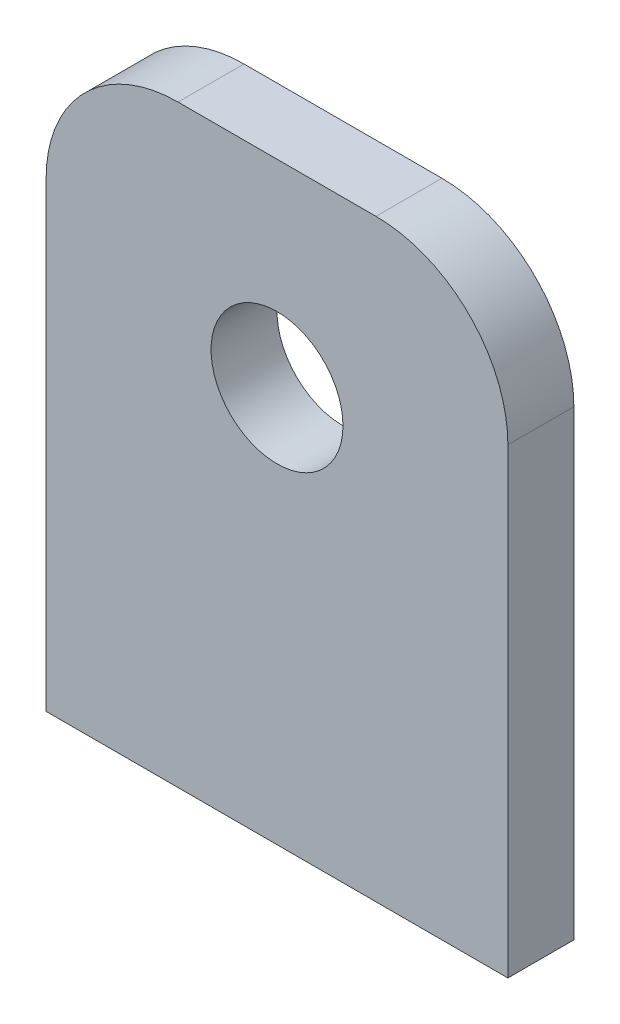
ISO-10303-21;
HEADER;
FILE_DESCRIPTION(('STEP AP214'),'2;1');
FILE_NAME('part.step','',(''),(''),'','','');
FILE_SCHEMA(('AUTOMOTIVE_DESIGN { 1 0 10303 214 1 1 1 1 }'));
ENDSEC;
DATA;
#1=APPLICATION_CONTEXT('core data for automotive mechanical design processes');
#2=APPLICATION_PROTOCOL_DEFINITION('international standard','automotive_design',2000,#1);
#3=PRODUCT_CONTEXT('',#1,'mechanical');
#4=PRODUCT('Part','Part','',(#3));
#5=PRODUCT_RELATED_PRODUCT_CATEGORY('part','',(#4));
#6=PRODUCT_DEFINITION_FORMATION('','',#4);
#7=PRODUCT_DEFINITION_CONTEXT('part definition',#1,'design');
#8=PRODUCT_DEFINITION('design','',#6,#7);
#9=PRODUCT_DEFINITION_SHAPE('','',#8);
#10=(LENGTH_UNIT() NAMED_UNIT(*) SI_UNIT(.MILLI.,.METRE.));
#11=(NAMED_UNIT(*) PLANE_ANGLE_UNIT() SI_UNIT($,.RADIAN.));
#12=(NAMED_UNIT(*) SI_UNIT($,.STERADIAN.) SOLID_ANGLE_UNIT());
#13=UNCERTAINTY_MEASURE_WITH_UNIT(LENGTH_MEASURE(1.E-05),#10,'distance_accuracy_value','');
#14=(GEOMETRIC_REPRESENTATION_CONTEXT(3) GLOBAL_UNCERTAINTY_ASSIGNED_CONTEXT((#13)) GLOBAL_UNIT_ASSIGNED_CONTEXT((#10,
#11,#12)) REPRESENTATION_CONTEXT('',''));
#15=CARTESIAN_POINT('',(0.,0.,0.));
#16=DIRECTION('',(0.,0.,1.));
#17=DIRECTION('',(1.,0.,0.));
#18=AXIS2_PLACEMENT_3D('',#15,#16,#17);
#19=CARTESIAN_POINT('',(11.1125,-14.2875,3.175));
#20=DIRECTION('',(-1.,0.,0.));
#21=DIRECTION('',(0.,0.,1.));
#22=AXIS2_PLACEMENT_3D('',#19,#20,#21);
#23=PLANE('',#22);
#24=DIRECTION('',(0.,1.,0.));
#25=VECTOR('',#24,1.);
#26=CARTESIAN_POINT('',(11.1125,-14.2875,0.));
#27=LINE('',#26,#25);
#28=CARTESIAN_POINT('',(11.1125,-14.2875,0.));
#29=VERTEX_POINT('',#28);
#30=CARTESIAN_POINT('',(11.1125,7.93750000000001,0.));
#31=VERTEX_POINT('',#30);
#32=EDGE_CURVE('E117',#29,#31,#27,.T.);
#33=ORIENTED_EDGE('',*,*,#32,.T.);
#34=DIRECTION('',(0.,0.,-1.));
#35=VECTOR('',#34,1.);
#36=CARTESIAN_POINT('',(11.1125,7.93750000000001,3.175));
#37=LINE('',#36,#35);
#38=CARTESIAN_POINT('',(11.1125,7.93750000000001,3.175));
#39=VERTEX_POINT('',#38);
#40=EDGE_CURVE('E11',#31,#39,#37,.F.);
#41=ORIENTED_EDGE('',*,*,#40,.T.);
#42=DIRECTION('',(0.,1.,0.));
#43=VECTOR('',#42,1.);
#44=CARTESIAN_POINT('',(11.1125,-14.2875,3.175));
#45=LINE('',#44,#43);
#46=CARTESIAN_POINT('',(11.1125,-14.2875,3.175));
#47=VERTEX_POINT('',#46);
#48=EDGE_CURVE('E124',#47,#39,#45,.T.);
#49=ORIENTED_EDGE('',*,*,#48,.F.);
#50=DIRECTION('',(0.,0.,-1.));
#51=VECTOR('',#50,1.);
#52=CARTESIAN_POINT('',(11.1125,-14.2875,3.175));
#53=LINE('',#52,#51);
#54=EDGE_CURVE('E109',#47,#29,#53,.T.);
#55=ORIENTED_EDGE('',*,*,#54,.T.);
#56=EDGE_LOOP('',(#33,#41,#49,#55));
#57=FACE_BOUND('',#56,.T.);
#58=ADVANCED_FACE('F35',(#57),#23,.F.);
#59=CARTESIAN_POINT('',(-11.1125,14.2875,3.175));
#60=DIRECTION('',(0.,-1.,0.));
#61=DIRECTION('',(0.,0.,-1.));
#62=AXIS2_PLACEMENT_3D('',#59,#60,#61);
#63=PLANE('',#62);
#64=DIRECTION('',(-1.,0.,0.));
#65=VECTOR('',#64,1.);
#66=CARTESIAN_POINT('',(-11.1125,14.2875,0.));
#67=LINE('',#66,#65);
#68=CARTESIAN_POINT('',(4.7625,14.2875,0.));
#69=VERTEX_POINT('',#68);
#70=CARTESIAN_POINT('',(-4.7625,14.2875,0.));
#71=VERTEX_POINT('',#70);
#72=EDGE_CURVE('E119',#69,#71,#67,.T.);
#73=ORIENTED_EDGE('',*,*,#72,.T.);
#74=DIRECTION('',(0.,0.,-1.));
#75=VECTOR('',#74,1.);
#76=CARTESIAN_POINT('',(-4.7625,14.2875,3.175));
#77=LINE('',#76,#75);
#78=CARTESIAN_POINT('',(-4.7625,14.2875,3.175));
#79=VERTEX_POINT('',#78);
#80=EDGE_CURVE('E56',#71,#79,#77,.F.);
#81=ORIENTED_EDGE('',*,*,#80,.T.);
#82=DIRECTION('',(-1.,0.,0.));
#83=VECTOR('',#82,1.);
#84=CARTESIAN_POINT('',(-11.1125,14.2875,3.175));
#85=LINE('',#84,#83);
#86=CARTESIAN_POINT('',(4.7625,14.2875,3.175));
#87=VERTEX_POINT('',#86);
#88=EDGE_CURVE('E99',#87,#79,#85,.T.);
#89=ORIENTED_EDGE('',*,*,#88,.F.);
#90=DIRECTION('',(0.,0.,-1.));
#91=VECTOR('',#90,1.);
#92=CARTESIAN_POINT('',(4.7625,14.2875,3.175));
#93=LINE('',#92,#91);
#94=EDGE_CURVE('E131',#87,#69,#93,.T.);
#95=ORIENTED_EDGE('',*,*,#94,.T.);
#96=EDGE_LOOP('',(#73,#81,#89,#95));
#97=FACE_BOUND('',#96,.T.);
#98=ADVANCED_FACE('F139',(#97),#63,.F.);
#99=CARTESIAN_POINT('',(-11.1125,-14.2875,3.175));
#100=DIRECTION('',(1.,0.,0.));
#101=DIRECTION('',(0.,0.,-1.));
#102=AXIS2_PLACEMENT_3D('',#99,#100,#101);
#103=PLANE('',#102);
#104=DIRECTION('',(0.,-1.,0.));
#105=VECTOR('',#104,1.);
#106=CARTESIAN_POINT('',(-11.1125,-14.2875,3.175));
#107=LINE('',#106,#105);
#108=CARTESIAN_POINT('',(-11.1125,7.93750000000001,3.175));
#109=VERTEX_POINT('',#108);
#110=CARTESIAN_POINT('',(-11.1125,-14.2875,3.175));
#111=VERTEX_POINT('',#110);
#112=EDGE_CURVE('E89',#109,#111,#107,.T.);
#113=ORIENTED_EDGE('',*,*,#112,.F.);
#114=DIRECTION('',(0.,0.,-1.));
#115=VECTOR('',#114,1.);
#116=CARTESIAN_POINT('',(-11.1125,7.93750000000001,3.175));
#117=LINE('',#116,#115);
#118=CARTESIAN_POINT('',(-11.1125,7.93750000000001,0.));
#119=VERTEX_POINT('',#118);
#120=EDGE_CURVE('E108',#109,#119,#117,.T.);
#121=ORIENTED_EDGE('',*,*,#120,.T.);
#122=DIRECTION('',(0.,-1.,0.));
#123=VECTOR('',#122,1.);
#124=CARTESIAN_POINT('',(-11.1125,-14.2875,0.));
#125=LINE('',#124,#123);
#126=CARTESIAN_POINT('',(-11.1125,-14.2875,0.));
#127=VERTEX_POINT('',#126);
#128=EDGE_CURVE('E105',#119,#127,#125,.T.);
#129=ORIENTED_EDGE('',*,*,#128,.T.);
#130=DIRECTION('',(0.,0.,-1.));
#131=VECTOR('',#130,1.);
#132=CARTESIAN_POINT('',(-11.1125,-14.2875,3.175));
#133=LINE('',#132,#131);
#134=EDGE_CURVE('E102',#111,#127,#133,.T.);
#135=ORIENTED_EDGE('',*,*,#134,.F.);
#136=EDGE_LOOP('',(#113,#121,#129,#135));
#137=FACE_BOUND('',#136,.T.);
#138=ADVANCED_FACE('F103',(#137),#103,.F.);
#139=CARTESIAN_POINT('',(-11.1125,-14.2875,3.175));
#140=DIRECTION('',(0.,1.,0.));
#141=DIRECTION('',(0.,0.,1.));
#142=AXIS2_PLACEMENT_3D('',#139,#140,#141);
#143=PLANE('',#142);
#144=DIRECTION('',(1.,0.,0.));
#145=VECTOR('',#144,1.);
#146=CARTESIAN_POINT('',(-11.1125,-14.2875,0.));
#147=LINE('',#146,#145);
#148=EDGE_CURVE('E123',#127,#29,#147,.T.);
#149=ORIENTED_EDGE('',*,*,#148,.T.);
#150=ORIENTED_EDGE('',*,*,#54,.F.);
#151=DIRECTION('',(1.,0.,0.));
#152=VECTOR('',#151,1.);
#153=CARTESIAN_POINT('',(-11.1125,-14.2875,3.175));
#154=LINE('',#153,#152);
#155=EDGE_CURVE('E93',#111,#47,#154,.T.);
#156=ORIENTED_EDGE('',*,*,#155,.F.);
#157=ORIENTED_EDGE('',*,*,#134,.T.);
#158=EDGE_LOOP('',(#149,#150,#156,#157));
#159=FACE_BOUND('',#158,.T.);
#160=ADVANCED_FACE('F111',(#159),#143,.F.);
#161=CARTESIAN_POINT('',(11.1125,14.2875,3.175));
#162=DIRECTION('',(0.,0.,-1.));
#163=DIRECTION('',(-1.,0.,0.));
#164=AXIS2_PLACEMENT_3D('',#161,#162,#163);
#165=PLANE('',#164);
#166=CARTESIAN_POINT('',(0.,4.76250000000001,3.175));
#167=DIRECTION('',(0.,0.,1.));
#168=DIRECTION('',(1.,0.,0.));
#169=AXIS2_PLACEMENT_3D('',#166,#167,#168);
#170=CIRCLE('',#169,3.175);
#171=CARTESIAN_POINT('',(3.175,4.76250000000001,3.175));
#172=VERTEX_POINT('',#171);
#173=EDGE_CURVE('E146',#172,#172,#170,.T.);
#174=ORIENTED_EDGE('',*,*,#173,.F.);
#175=EDGE_LOOP('',(#174));
#176=FACE_BOUND('',#175,.T.);
#177=ORIENTED_EDGE('',*,*,#88,.T.);
#178=CARTESIAN_POINT('',(-4.7625,7.93750000000001,3.175));
#179=DIRECTION('',(0.,0.,-1.));
#180=DIRECTION('',(-1.,0.,0.));
#181=AXIS2_PLACEMENT_3D('',#178,#179,#180);
#182=CIRCLE('',#181,6.35);
#183=EDGE_CURVE('E43',#79,#109,#182,.F.);
#184=ORIENTED_EDGE('',*,*,#183,.T.);
#185=ORIENTED_EDGE('',*,*,#112,.T.);
#186=ORIENTED_EDGE('',*,*,#155,.T.);
#187=ORIENTED_EDGE('',*,*,#48,.T.);
#188=CARTESIAN_POINT('',(4.7625,7.93750000000001,3.175));
#189=DIRECTION('',(0.,0.,-1.));
#190=DIRECTION('',(-1.,0.,0.));
#191=AXIS2_PLACEMENT_3D('',#188,#189,#190);
#192=CIRCLE('',#191,6.35);
#193=EDGE_CURVE('E135',#39,#87,#192,.F.);
#194=ORIENTED_EDGE('',*,*,#193,.T.);
#195=EDGE_LOOP('',(#177,#184,#185,#186,#187,#194));
#196=FACE_BOUND('',#195,.T.);
#197=ADVANCED_FACE('F91',(#176,#196),#165,.F.);
#198=CARTESIAN_POINT('',(11.1125,14.2875,0.));
#199=DIRECTION('',(0.,0.,-1.));
#200=DIRECTION('',(-1.,0.,0.));
#201=AXIS2_PLACEMENT_3D('',#198,#199,#200);
#202=PLANE('',#201);
#203=CARTESIAN_POINT('',(0.,4.76250000000001,0.));
#204=DIRECTION('',(0.,0.,1.));
#205=DIRECTION('',(1.,0.,0.));
#206=AXIS2_PLACEMENT_3D('',#203,#204,#205);
#207=CIRCLE('',#206,3.175);
#208=CARTESIAN_POINT('',(3.175,4.76250000000001,0.));
#209=VERTEX_POINT('',#208);
#210=EDGE_CURVE('E120',#209,#209,#207,.T.);
#211=ORIENTED_EDGE('',*,*,#210,.T.);
#212=EDGE_LOOP('',(#211));
#213=FACE_BOUND('',#212,.T.);
#214=ORIENTED_EDGE('',*,*,#128,.F.);
#215=CARTESIAN_POINT('',(-4.7625,7.93750000000001,0.));
#216=DIRECTION('',(0.,0.,-1.));
#217=DIRECTION('',(-1.,0.,0.));
#218=AXIS2_PLACEMENT_3D('',#215,#216,#217);
#219=CIRCLE('',#218,6.35);
#220=EDGE_CURVE('E129',#119,#71,#219,.T.);
#221=ORIENTED_EDGE('',*,*,#220,.T.);
#222=ORIENTED_EDGE('',*,*,#72,.F.);
#223=CARTESIAN_POINT('',(4.7625,7.93750000000001,0.));
#224=DIRECTION('',(0.,0.,-1.));
#225=DIRECTION('',(-1.,0.,0.));
#226=AXIS2_PLACEMENT_3D('',#223,#224,#225);
#227=CIRCLE('',#226,6.35);
#228=EDGE_CURVE('E127',#69,#31,#227,.T.);
#229=ORIENTED_EDGE('',*,*,#228,.T.);
#230=ORIENTED_EDGE('',*,*,#32,.F.);
#231=ORIENTED_EDGE('',*,*,#148,.F.);
#232=EDGE_LOOP('',(#214,#221,#222,#229,#230,#231));
#233=FACE_BOUND('',#232,.T.);
#234=ADVANCED_FACE('F143',(#213,#233),#202,.T.);
#235=CARTESIAN_POINT('',(-4.7625,7.93750000000001,3.175));
#236=DIRECTION('',(0.,0.,-1.));
#237=DIRECTION('',(-1.,0.,0.));
#238=AXIS2_PLACEMENT_3D('',#235,#236,#237);
#239=CYLINDRICAL_SURFACE('',#238,6.35);
#240=ORIENTED_EDGE('',*,*,#183,.F.);
#241=ORIENTED_EDGE('',*,*,#80,.F.);
#242=ORIENTED_EDGE('',*,*,#220,.F.);
#243=ORIENTED_EDGE('',*,*,#120,.F.);
#244=EDGE_LOOP('',(#240,#241,#242,#243));
#245=FACE_BOUND('',#244,.T.);
#246=ADVANCED_FACE('F165',(#245),#239,.T.);
#247=CARTESIAN_POINT('',(4.7625,7.93750000000001,3.175));
#248=DIRECTION('',(0.,0.,-1.));
#249=DIRECTION('',(-1.,0.,0.));
#250=AXIS2_PLACEMENT_3D('',#247,#248,#249);
#251=CYLINDRICAL_SURFACE('',#250,6.35);
#252=ORIENTED_EDGE('',*,*,#193,.F.);
#253=ORIENTED_EDGE('',*,*,#40,.F.);
#254=ORIENTED_EDGE('',*,*,#228,.F.);
#255=ORIENTED_EDGE('',*,*,#94,.F.);
#256=EDGE_LOOP('',(#252,#253,#254,#255));
#257=FACE_BOUND('',#256,.T.);
#258=ADVANCED_FACE('F37',(#257),#251,.T.);
#259=CARTESIAN_POINT('',(0.,4.76250000000001,0.));
#260=DIRECTION('',(0.,0.,1.));
#261=DIRECTION('',(1.,0.,0.));
#262=AXIS2_PLACEMENT_3D('',#259,#260,#261);
#263=CYLINDRICAL_SURFACE('',#262,3.175);
#264=ORIENTED_EDGE('',*,*,#210,.F.);
#265=EDGE_LOOP('',(#264));
#266=FACE_BOUND('',#265,.T.);
#267=ORIENTED_EDGE('',*,*,#173,.T.);
#268=EDGE_LOOP('',(#267));
#269=FACE_BOUND('',#268,.T.);
#270=ADVANCED_FACE('F153',(#266,#269),#263,.F.);
#271=CLOSED_SHELL('',(#58,#98,#138,#160,#197,#234,#246,#258,#270));
#272=MANIFOLD_SOLID_BREP('B2',#271);
#273=ADVANCED_BREP_SHAPE_REPRESENTATION('',(#18,#272),#14);
#274=SHAPE_DEFINITION_REPRESENTATION(#9,#273);
ENDSEC;
END-ISO-10303-21;
